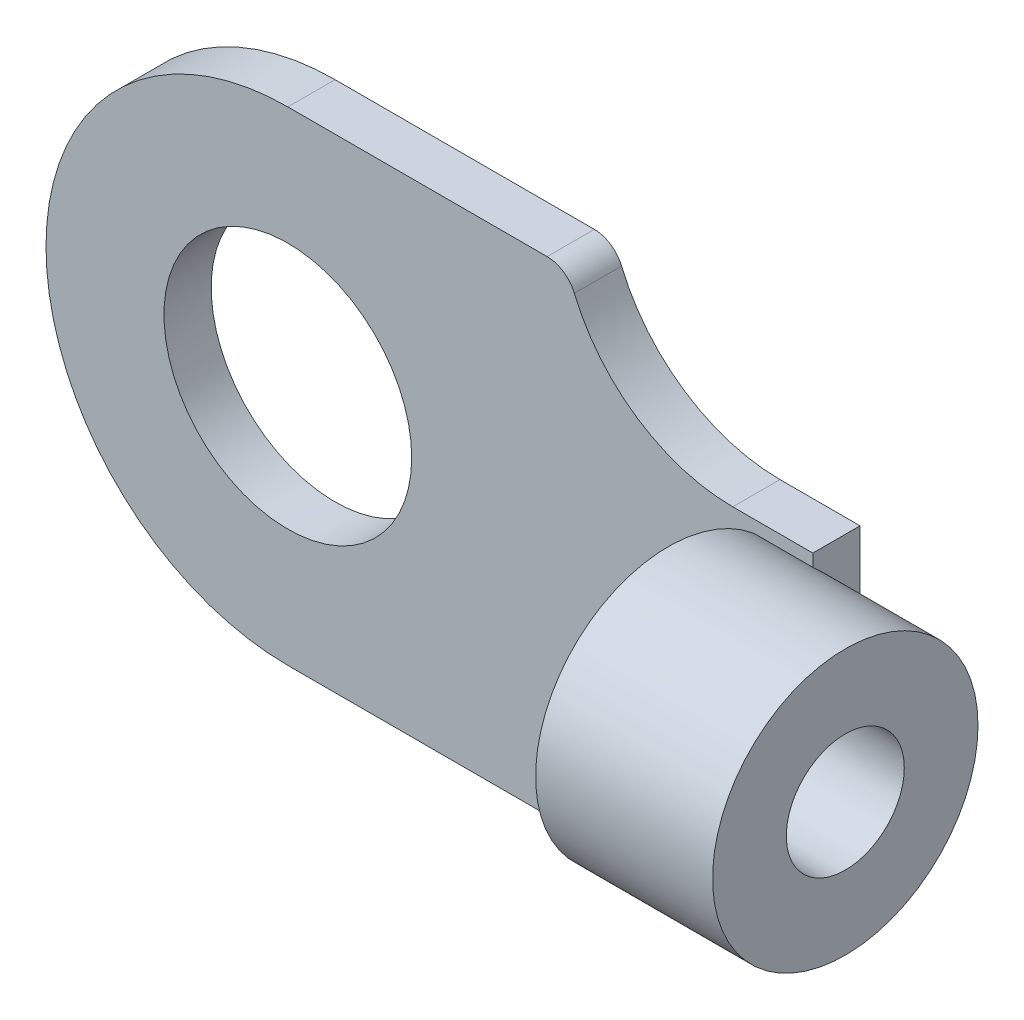
ISO-10303-21;
HEADER;
FILE_DESCRIPTION(('STEP AP214'),'2;1');
FILE_NAME('part.step','',(''),(''),'','','');
FILE_SCHEMA(('AUTOMOTIVE_DESIGN { 1 0 10303 214 1 1 1 1 }'));
ENDSEC;
DATA;
#1=APPLICATION_CONTEXT('core data for automotive mechanical design processes');
#2=APPLICATION_PROTOCOL_DEFINITION('international standard','automotive_design',2000,#1);
#3=PRODUCT_CONTEXT('',#1,'mechanical');
#4=PRODUCT('Part','Part','',(#3));
#5=PRODUCT_RELATED_PRODUCT_CATEGORY('part','',(#4));
#6=PRODUCT_DEFINITION_FORMATION('','',#4);
#7=PRODUCT_DEFINITION_CONTEXT('part definition',#1,'design');
#8=PRODUCT_DEFINITION('design','',#6,#7);
#9=PRODUCT_DEFINITION_SHAPE('','',#8);
#10=(LENGTH_UNIT() NAMED_UNIT(*) SI_UNIT(.MILLI.,.METRE.));
#11=(NAMED_UNIT(*) PLANE_ANGLE_UNIT() SI_UNIT($,.RADIAN.));
#12=(NAMED_UNIT(*) SI_UNIT($,.STERADIAN.) SOLID_ANGLE_UNIT());
#13=UNCERTAINTY_MEASURE_WITH_UNIT(LENGTH_MEASURE(1.E-05),#10,'distance_accuracy_value','');
#14=(GEOMETRIC_REPRESENTATION_CONTEXT(3) GLOBAL_UNCERTAINTY_ASSIGNED_CONTEXT((#13)) GLOBAL_UNIT_ASSIGNED_CONTEXT((#10,
#11,#12)) REPRESENTATION_CONTEXT('',''));
#15=CARTESIAN_POINT('',(0.,0.,0.));
#16=DIRECTION('',(0.,0.,1.));
#17=DIRECTION('',(1.,0.,0.));
#18=AXIS2_PLACEMENT_3D('',#15,#16,#17);
#19=CARTESIAN_POINT('',(10.25,0.180380871620109,0.8));
#20=DIRECTION('',(-1.,0.,0.));
#21=DIRECTION('',(0.,-1.,0.));
#22=AXIS2_PLACEMENT_3D('',#19,#20,#21);
#23=PLANE('',#22);
#24=CARTESIAN_POINT('',(10.25,0.,2.25));
#25=DIRECTION('',(1.,0.,0.));
#26=DIRECTION('',(0.,0.,-1.));
#27=AXIS2_PLACEMENT_3D('',#24,#25,#26);
#28=CIRCLE('',#27,1.);
#29=CARTESIAN_POINT('',(10.25,0.,1.25));
#30=VERTEX_POINT('',#29);
#31=EDGE_CURVE('E145',#30,#30,#28,.T.);
#32=ORIENTED_EDGE('',*,*,#31,.F.);
#33=EDGE_LOOP('',(#32));
#34=FACE_BOUND('',#33,.T.);
#35=CARTESIAN_POINT('',(10.25,0.,2.25));
#36=DIRECTION('',(1.,0.,0.));
#37=DIRECTION('',(0.,0.,-1.));
#38=AXIS2_PLACEMENT_3D('',#35,#36,#37);
#39=CIRCLE('',#38,2.25);
#40=CARTESIAN_POINT('',(10.25,0.,0.));
#41=VERTEX_POINT('',#40);
#42=EDGE_CURVE('E260',#41,#41,#39,.T.);
#43=ORIENTED_EDGE('',*,*,#42,.T.);
#44=EDGE_LOOP('',(#43));
#45=FACE_BOUND('',#44,.T.);
#46=ADVANCED_FACE('F31',(#34,#45),#23,.F.);
#47=CARTESIAN_POINT('',(6.8929732239143,4.83939185197431,0.8));
#48=DIRECTION('',(0.,0.,1.));
#49=DIRECTION('',(1.,0.,0.));
#50=AXIS2_PLACEMENT_3D('',#47,#48,#49);
#51=PLANE('',#50);
#52=DIRECTION('',(0.,-1.,0.));
#53=VECTOR('',#52,1.);
#54=CARTESIAN_POINT('',(8.25,4.83939185197431,0.8));
#55=LINE('',#54,#53);
#56=CARTESIAN_POINT('',(8.25,1.9303808716201,0.8));
#57=VERTEX_POINT('',#56);
#58=CARTESIAN_POINT('',(8.25,1.72046505340854,0.799999999999999));
#59=VERTEX_POINT('',#58);
#60=EDGE_CURVE('E148',#57,#59,#55,.T.);
#61=ORIENTED_EDGE('',*,*,#60,.F.);
#62=DIRECTION('',(-1.,0.,0.));
#63=VECTOR('',#62,1.);
#64=CARTESIAN_POINT('',(10.25,1.9303808716201,0.8));
#65=LINE('',#64,#63);
#66=CARTESIAN_POINT('',(6.8929732239143,1.9303808716201,0.8));
#67=VERTEX_POINT('',#66);
#68=EDGE_CURVE('E180',#57,#67,#65,.T.);
#69=ORIENTED_EDGE('',*,*,#68,.T.);
#70=CARTESIAN_POINT('',(6.8929732239143,4.83939185197431,0.8));
#71=DIRECTION('',(0.,0.,-1.));
#72=DIRECTION('',(1.,0.,0.));
#73=AXIS2_PLACEMENT_3D('',#70,#71,#72);
#74=CIRCLE('',#73,2.90901098035421);
#75=CARTESIAN_POINT('',(4.20696964598898,3.72237365015585,0.8));
#76=VERTEX_POINT('',#75);
#77=EDGE_CURVE('E167',#67,#76,#74,.T.);
#78=ORIENTED_EDGE('',*,*,#77,.T.);
#79=CARTESIAN_POINT('',(3.74530009642986,3.5303808716201,0.8));
#80=DIRECTION('',(0.,0.,1.));
#81=DIRECTION('',(1.,0.,0.));
#82=AXIS2_PLACEMENT_3D('',#79,#80,#81);
#83=CIRCLE('',#82,0.5);
#84=CARTESIAN_POINT('',(3.74530009642986,4.0303808716201,0.8));
#85=VERTEX_POINT('',#84);
#86=EDGE_CURVE('E54',#76,#85,#83,.T.);
#87=ORIENTED_EDGE('',*,*,#86,.T.);
#88=DIRECTION('',(-1.,0.,0.));
#89=VECTOR('',#88,1.);
#90=CARTESIAN_POINT('',(-0.65,4.0303808716201,0.8));
#91=LINE('',#90,#89);
#92=CARTESIAN_POINT('',(-0.65,4.0303808716201,0.8));
#93=VERTEX_POINT('',#92);
#94=EDGE_CURVE('E169',#85,#93,#91,.T.);
#95=ORIENTED_EDGE('',*,*,#94,.T.);
#96=CARTESIAN_POINT('',(-0.649999999999999,-0.0696191283799023,0.8));
#97=DIRECTION('',(0.,0.,1.));
#98=DIRECTION('',(1.,0.,0.));
#99=AXIS2_PLACEMENT_3D('',#96,#97,#98);
#100=CIRCLE('',#99,4.1);
#101=CARTESIAN_POINT('',(-0.649999999999998,-4.1696191283799,0.8));
#102=VERTEX_POINT('',#101);
#103=EDGE_CURVE('E172',#93,#102,#100,.T.);
#104=ORIENTED_EDGE('',*,*,#103,.T.);
#105=DIRECTION('',(1.,0.,0.));
#106=VECTOR('',#105,1.);
#107=CARTESIAN_POINT('',(-0.649999999999998,-4.1696191283799,0.8));
#108=LINE('',#107,#106);
#109=CARTESIAN_POINT('',(3.74530009642986,-4.1696191283799,0.8));
#110=VERTEX_POINT('',#109);
#111=EDGE_CURVE('E174',#102,#110,#108,.T.);
#112=ORIENTED_EDGE('',*,*,#111,.T.);
#113=CARTESIAN_POINT('',(3.74530009642986,-3.6696191283799,0.8));
#114=DIRECTION('',(0.,0.,1.));
#115=DIRECTION('',(1.,0.,0.));
#116=AXIS2_PLACEMENT_3D('',#113,#114,#115);
#117=CIRCLE('',#116,0.5);
#118=CARTESIAN_POINT('',(4.20696964598898,-3.86161190691566,0.8));
#119=VERTEX_POINT('',#118);
#120=EDGE_CURVE('E219',#110,#119,#117,.T.);
#121=ORIENTED_EDGE('',*,*,#120,.T.);
#122=CARTESIAN_POINT('',(6.8929732239143,-4.97863010873411,0.8));
#123=DIRECTION('',(0.,0.,-1.));
#124=DIRECTION('',(-1.,0.,0.));
#125=AXIS2_PLACEMENT_3D('',#122,#123,#124);
#126=CIRCLE('',#125,2.90901098035421);
#127=CARTESIAN_POINT('',(6.8929732239143,-2.0696191283799,0.8));
#128=VERTEX_POINT('',#127);
#129=EDGE_CURVE('E177',#119,#128,#126,.T.);
#130=ORIENTED_EDGE('',*,*,#129,.T.);
#131=DIRECTION('',(1.,0.,0.));
#132=VECTOR('',#131,1.);
#133=CARTESIAN_POINT('',(10.25,-2.0696191283799,0.8));
#134=LINE('',#133,#132);
#135=CARTESIAN_POINT('',(8.25,-2.0696191283799,0.8));
#136=VERTEX_POINT('',#135);
#137=EDGE_CURVE('E144',#128,#136,#134,.T.);
#138=ORIENTED_EDGE('',*,*,#137,.T.);
#139=CARTESIAN_POINT('',(8.25,-1.72046505340851,0.8));
#140=VERTEX_POINT('',#139);
#141=EDGE_CURVE('E126',#140,#136,#55,.T.);
#142=ORIENTED_EDGE('',*,*,#141,.F.);
#143=DIRECTION('',(1.,0.,0.));
#144=VECTOR('',#143,1.);
#145=CARTESIAN_POINT('',(7.25,-1.72046505340852,0.8));
#146=LINE('',#145,#144);
#147=CARTESIAN_POINT('',(7.25,-1.72046505340852,0.8));
#148=VERTEX_POINT('',#147);
#149=EDGE_CURVE('E141',#148,#140,#146,.T.);
#150=ORIENTED_EDGE('',*,*,#149,.F.);
#151=DIRECTION('',(0.,1.,0.));
#152=VECTOR('',#151,1.);
#153=CARTESIAN_POINT('',(7.25,4.83939185197431,0.8));
#154=LINE('',#153,#152);
#155=CARTESIAN_POINT('',(7.25,1.72046505340854,0.8));
#156=VERTEX_POINT('',#155);
#157=EDGE_CURVE('E153',#148,#156,#154,.T.);
#158=ORIENTED_EDGE('',*,*,#157,.T.);
#159=DIRECTION('',(1.,0.,0.));
#160=VECTOR('',#159,1.);
#161=CARTESIAN_POINT('',(7.25,1.72046505340854,0.8));
#162=LINE('',#161,#160);
#163=EDGE_CURVE('E154',#59,#156,#162,.F.);
#164=ORIENTED_EDGE('',*,*,#163,.F.);
#165=EDGE_LOOP('',(#61,#69,#78,#87,#95,#104,#112,#121,#130,#138,#142,#150,#158,#164));
#166=FACE_BOUND('',#165,.T.);
#167=CARTESIAN_POINT('',(-0.649999999999999,-0.0696191283799023,0.8));
#168=DIRECTION('',(0.,0.,1.));
#169=DIRECTION('',(1.,0.,0.));
#170=AXIS2_PLACEMENT_3D('',#167,#168,#169);
#171=CIRCLE('',#170,2.1);
#172=CARTESIAN_POINT('',(1.45,-0.0696191283799023,0.8));
#173=VERTEX_POINT('',#172);
#174=EDGE_CURVE('E161',#173,#173,#171,.T.);
#175=ORIENTED_EDGE('',*,*,#174,.F.);
#176=EDGE_LOOP('',(#175));
#177=FACE_BOUND('',#176,.T.);
#178=ADVANCED_FACE('F138',(#166,#177),#51,.T.);
#179=CARTESIAN_POINT('',(6.8929732239143,4.83939185197431,0.));
#180=DIRECTION('',(0.,0.,1.));
#181=DIRECTION('',(1.,0.,0.));
#182=AXIS2_PLACEMENT_3D('',#179,#180,#181);
#183=PLANE('',#182);
#184=DIRECTION('',(-1.,0.,0.));
#185=VECTOR('',#184,1.);
#186=CARTESIAN_POINT('',(10.25,1.9303808716201,0.));
#187=LINE('',#186,#185);
#188=CARTESIAN_POINT('',(8.25,1.9303808716201,0.));
#189=VERTEX_POINT('',#188);
#190=CARTESIAN_POINT('',(6.8929732239143,1.9303808716201,0.));
#191=VERTEX_POINT('',#190);
#192=EDGE_CURVE('E170',#189,#191,#187,.T.);
#193=ORIENTED_EDGE('',*,*,#192,.F.);
#194=DIRECTION('',(0.,-1.,0.));
#195=VECTOR('',#194,1.);
#196=CARTESIAN_POINT('',(8.25,4.83939185197431,0.));
#197=LINE('',#196,#195);
#198=CARTESIAN_POINT('',(8.25,0.,0.));
#199=VERTEX_POINT('',#198);
#200=EDGE_CURVE('E46',#189,#199,#197,.T.);
#201=ORIENTED_EDGE('',*,*,#200,.T.);
#202=CARTESIAN_POINT('',(8.25,-2.0696191283799,0.));
#203=VERTEX_POINT('',#202);
#204=EDGE_CURVE('E129',#199,#203,#197,.T.);
#205=ORIENTED_EDGE('',*,*,#204,.T.);
#206=DIRECTION('',(1.,0.,0.));
#207=VECTOR('',#206,1.);
#208=CARTESIAN_POINT('',(10.25,-2.0696191283799,0.));
#209=LINE('',#208,#207);
#210=CARTESIAN_POINT('',(6.8929732239143,-2.0696191283799,0.));
#211=VERTEX_POINT('',#210);
#212=EDGE_CURVE('E194',#211,#203,#209,.T.);
#213=ORIENTED_EDGE('',*,*,#212,.F.);
#214=CARTESIAN_POINT('',(6.8929732239143,-4.97863010873411,0.));
#215=DIRECTION('',(0.,0.,-1.));
#216=DIRECTION('',(-1.,0.,0.));
#217=AXIS2_PLACEMENT_3D('',#214,#215,#216);
#218=CIRCLE('',#217,2.90901098035421);
#219=CARTESIAN_POINT('',(4.20696964598898,-3.86161190691566,0.));
#220=VERTEX_POINT('',#219);
#221=EDGE_CURVE('E192',#220,#211,#218,.T.);
#222=ORIENTED_EDGE('',*,*,#221,.F.);
#223=CARTESIAN_POINT('',(3.74530009642986,-3.6696191283799,0.));
#224=DIRECTION('',(0.,0.,1.));
#225=DIRECTION('',(1.,0.,0.));
#226=AXIS2_PLACEMENT_3D('',#223,#224,#225);
#227=CIRCLE('',#226,0.5);
#228=CARTESIAN_POINT('',(3.74530009642986,-4.1696191283799,0.));
#229=VERTEX_POINT('',#228);
#230=EDGE_CURVE('E214',#220,#229,#227,.F.);
#231=ORIENTED_EDGE('',*,*,#230,.T.);
#232=DIRECTION('',(1.,0.,0.));
#233=VECTOR('',#232,1.);
#234=CARTESIAN_POINT('',(-0.649999999999998,-4.1696191283799,0.));
#235=LINE('',#234,#233);
#236=CARTESIAN_POINT('',(-0.649999999999998,-4.1696191283799,0.));
#237=VERTEX_POINT('',#236);
#238=EDGE_CURVE('E189',#237,#229,#235,.T.);
#239=ORIENTED_EDGE('',*,*,#238,.F.);
#240=CARTESIAN_POINT('',(-0.649999999999999,-0.0696191283799023,0.));
#241=DIRECTION('',(0.,0.,1.));
#242=DIRECTION('',(1.,0.,0.));
#243=AXIS2_PLACEMENT_3D('',#240,#241,#242);
#244=CIRCLE('',#243,4.1);
#245=CARTESIAN_POINT('',(-0.65,4.0303808716201,0.));
#246=VERTEX_POINT('',#245);
#247=EDGE_CURVE('E187',#246,#237,#244,.T.);
#248=ORIENTED_EDGE('',*,*,#247,.F.);
#249=DIRECTION('',(-1.,0.,0.));
#250=VECTOR('',#249,1.);
#251=CARTESIAN_POINT('',(-0.65,4.0303808716201,0.));
#252=LINE('',#251,#250);
#253=CARTESIAN_POINT('',(3.74530009642986,4.0303808716201,0.));
#254=VERTEX_POINT('',#253);
#255=EDGE_CURVE('E185',#254,#246,#252,.T.);
#256=ORIENTED_EDGE('',*,*,#255,.F.);
#257=CARTESIAN_POINT('',(3.74530009642986,3.5303808716201,0.));
#258=DIRECTION('',(0.,0.,1.));
#259=DIRECTION('',(1.,0.,0.));
#260=AXIS2_PLACEMENT_3D('',#257,#258,#259);
#261=CIRCLE('',#260,0.5);
#262=CARTESIAN_POINT('',(4.20696964598898,3.72237365015585,0.));
#263=VERTEX_POINT('',#262);
#264=EDGE_CURVE('E212',#254,#263,#261,.F.);
#265=ORIENTED_EDGE('',*,*,#264,.T.);
#266=CARTESIAN_POINT('',(6.8929732239143,4.83939185197431,0.));
#267=DIRECTION('',(0.,0.,-1.));
#268=DIRECTION('',(1.,0.,0.));
#269=AXIS2_PLACEMENT_3D('',#266,#267,#268);
#270=CIRCLE('',#269,2.90901098035421);
#271=EDGE_CURVE('E164',#191,#263,#270,.T.);
#272=ORIENTED_EDGE('',*,*,#271,.F.);
#273=EDGE_LOOP('',(#193,#201,#205,#213,#222,#231,#239,#248,#256,#265,#272));
#274=FACE_BOUND('',#273,.T.);
#275=CARTESIAN_POINT('',(-0.649999999999999,-0.0696191283799023,0.));
#276=DIRECTION('',(0.,0.,1.));
#277=DIRECTION('',(1.,0.,0.));
#278=AXIS2_PLACEMENT_3D('',#275,#276,#277);
#279=CIRCLE('',#278,2.1);
#280=CARTESIAN_POINT('',(1.45,-0.0696191283799023,0.));
#281=VERTEX_POINT('',#280);
#282=EDGE_CURVE('E156',#281,#281,#279,.T.);
#283=ORIENTED_EDGE('',*,*,#282,.T.);
#284=EDGE_LOOP('',(#283));
#285=FACE_BOUND('',#284,.T.);
#286=ADVANCED_FACE('F230',(#274,#285),#183,.F.);
#287=CARTESIAN_POINT('',(6.8929732239143,4.83939185197431,0.8));
#288=DIRECTION('',(0.,0.,-1.));
#289=DIRECTION('',(-1.,0.,0.));
#290=AXIS2_PLACEMENT_3D('',#287,#288,#289);
#291=CYLINDRICAL_SURFACE('',#290,2.90901098035421);
#292=ORIENTED_EDGE('',*,*,#271,.T.);
#293=DIRECTION('',(0.,0.,-1.));
#294=VECTOR('',#293,1.);
#295=CARTESIAN_POINT('',(4.20696964598898,3.72237365015585,0.8));
#296=LINE('',#295,#294);
#297=EDGE_CURVE('E11',#263,#76,#296,.F.);
#298=ORIENTED_EDGE('',*,*,#297,.T.);
#299=ORIENTED_EDGE('',*,*,#77,.F.);
#300=DIRECTION('',(0.,0.,-1.));
#301=VECTOR('',#300,1.);
#302=CARTESIAN_POINT('',(6.8929732239143,1.9303808716201,0.8));
#303=LINE('',#302,#301);
#304=EDGE_CURVE('E182',#67,#191,#303,.T.);
#305=ORIENTED_EDGE('',*,*,#304,.T.);
#306=EDGE_LOOP('',(#292,#298,#299,#305));
#307=FACE_BOUND('',#306,.T.);
#308=ADVANCED_FACE('F302',(#307),#291,.F.);
#309=CARTESIAN_POINT('',(-0.65,4.0303808716201,0.8));
#310=DIRECTION('',(0.,-1.,0.));
#311=DIRECTION('',(0.,0.,-1.));
#312=AXIS2_PLACEMENT_3D('',#309,#310,#311);
#313=PLANE('',#312);
#314=ORIENTED_EDGE('',*,*,#94,.F.);
#315=DIRECTION('',(0.,0.,-1.));
#316=VECTOR('',#315,1.);
#317=CARTESIAN_POINT('',(3.74530009642986,4.0303808716201,0.8));
#318=LINE('',#317,#316);
#319=EDGE_CURVE('E39',#85,#254,#318,.T.);
#320=ORIENTED_EDGE('',*,*,#319,.T.);
#321=ORIENTED_EDGE('',*,*,#255,.T.);
#322=DIRECTION('',(0.,0.,-1.));
#323=VECTOR('',#322,1.);
#324=CARTESIAN_POINT('',(-0.65,4.0303808716201,0.8));
#325=LINE('',#324,#323);
#326=EDGE_CURVE('E206',#93,#246,#325,.T.);
#327=ORIENTED_EDGE('',*,*,#326,.F.);
#328=EDGE_LOOP('',(#314,#320,#321,#327));
#329=FACE_BOUND('',#328,.T.);
#330=ADVANCED_FACE('F224',(#329),#313,.F.);
#331=CARTESIAN_POINT('',(-0.649999999999999,-0.0696191283799023,0.8));
#332=DIRECTION('',(0.,0.,-1.));
#333=DIRECTION('',(-1.,0.,0.));
#334=AXIS2_PLACEMENT_3D('',#331,#332,#333);
#335=CYLINDRICAL_SURFACE('',#334,4.1);
#336=ORIENTED_EDGE('',*,*,#247,.T.);
#337=DIRECTION('',(0.,0.,-1.));
#338=VECTOR('',#337,1.);
#339=CARTESIAN_POINT('',(-0.649999999999998,-4.1696191283799,0.8));
#340=LINE('',#339,#338);
#341=EDGE_CURVE('E203',#102,#237,#340,.T.);
#342=ORIENTED_EDGE('',*,*,#341,.F.);
#343=ORIENTED_EDGE('',*,*,#103,.F.);
#344=ORIENTED_EDGE('',*,*,#326,.T.);
#345=EDGE_LOOP('',(#336,#342,#343,#344));
#346=FACE_BOUND('',#345,.T.);
#347=ADVANCED_FACE('F236',(#346),#335,.T.);
#348=CARTESIAN_POINT('',(-0.649999999999998,-4.1696191283799,0.8));
#349=DIRECTION('',(0.,1.,0.));
#350=DIRECTION('',(0.,0.,1.));
#351=AXIS2_PLACEMENT_3D('',#348,#349,#350);
#352=PLANE('',#351);
#353=ORIENTED_EDGE('',*,*,#238,.T.);
#354=DIRECTION('',(0.,0.,-1.));
#355=VECTOR('',#354,1.);
#356=CARTESIAN_POINT('',(3.74530009642986,-4.1696191283799,0.8));
#357=LINE('',#356,#355);
#358=EDGE_CURVE('E216',#229,#110,#357,.F.);
#359=ORIENTED_EDGE('',*,*,#358,.T.);
#360=ORIENTED_EDGE('',*,*,#111,.F.);
#361=ORIENTED_EDGE('',*,*,#341,.T.);
#362=EDGE_LOOP('',(#353,#359,#360,#361));
#363=FACE_BOUND('',#362,.T.);
#364=ADVANCED_FACE('F240',(#363),#352,.F.);
#365=CARTESIAN_POINT('',(6.8929732239143,-4.97863010873411,0.8));
#366=DIRECTION('',(0.,0.,-1.));
#367=DIRECTION('',(-1.,0.,0.));
#368=AXIS2_PLACEMENT_3D('',#365,#366,#367);
#369=CYLINDRICAL_SURFACE('',#368,2.90901098035421);
#370=ORIENTED_EDGE('',*,*,#129,.F.);
#371=DIRECTION('',(0.,0.,-1.));
#372=VECTOR('',#371,1.);
#373=CARTESIAN_POINT('',(4.20696964598898,-3.86161190691566,0.8));
#374=LINE('',#373,#372);
#375=EDGE_CURVE('E209',#119,#220,#374,.T.);
#376=ORIENTED_EDGE('',*,*,#375,.T.);
#377=ORIENTED_EDGE('',*,*,#221,.T.);
#378=DIRECTION('',(0.,0.,-1.));
#379=VECTOR('',#378,1.);
#380=CARTESIAN_POINT('',(6.8929732239143,-2.0696191283799,0.8));
#381=LINE('',#380,#379);
#382=EDGE_CURVE('E200',#128,#211,#381,.T.);
#383=ORIENTED_EDGE('',*,*,#382,.F.);
#384=EDGE_LOOP('',(#370,#376,#377,#383));
#385=FACE_BOUND('',#384,.T.);
#386=ADVANCED_FACE('F249',(#385),#369,.F.);
#387=CARTESIAN_POINT('',(10.25,-2.0696191283799,0.8));
#388=DIRECTION('',(0.,1.,0.));
#389=DIRECTION('',(-1.,0.,0.));
#390=AXIS2_PLACEMENT_3D('',#387,#388,#389);
#391=PLANE('',#390);
#392=ORIENTED_EDGE('',*,*,#212,.T.);
#393=DIRECTION('',(0.,0.,1.));
#394=VECTOR('',#393,1.);
#395=CARTESIAN_POINT('',(8.25,-2.0696191283799,0.8));
#396=LINE('',#395,#394);
#397=EDGE_CURVE('E146',#203,#136,#396,.T.);
#398=ORIENTED_EDGE('',*,*,#397,.T.);
#399=ORIENTED_EDGE('',*,*,#137,.F.);
#400=ORIENTED_EDGE('',*,*,#382,.T.);
#401=EDGE_LOOP('',(#392,#398,#399,#400));
#402=FACE_BOUND('',#401,.T.);
#403=ADVANCED_FACE('F253',(#402),#391,.F.);
#404=CARTESIAN_POINT('',(10.25,1.9303808716201,0.8));
#405=DIRECTION('',(0.,-1.,0.));
#406=DIRECTION('',(1.,0.,0.));
#407=AXIS2_PLACEMENT_3D('',#404,#405,#406);
#408=PLANE('',#407);
#409=ORIENTED_EDGE('',*,*,#68,.F.);
#410=DIRECTION('',(0.,0.,-1.));
#411=VECTOR('',#410,1.);
#412=CARTESIAN_POINT('',(8.25,1.9303808716201,0.8));
#413=LINE('',#412,#411);
#414=EDGE_CURVE('E133',#57,#189,#413,.T.);
#415=ORIENTED_EDGE('',*,*,#414,.T.);
#416=ORIENTED_EDGE('',*,*,#192,.T.);
#417=ORIENTED_EDGE('',*,*,#304,.F.);
#418=EDGE_LOOP('',(#409,#415,#416,#417));
#419=FACE_BOUND('',#418,.T.);
#420=ADVANCED_FACE('F278',(#419),#408,.F.);
#421=CARTESIAN_POINT('',(-0.649999999999999,-0.0696191283799023,0.8));
#422=DIRECTION('',(0.,0.,-1.));
#423=DIRECTION('',(-1.,0.,0.));
#424=AXIS2_PLACEMENT_3D('',#421,#422,#423);
#425=CYLINDRICAL_SURFACE('',#424,2.1);
#426=ORIENTED_EDGE('',*,*,#174,.T.);
#427=EDGE_LOOP('',(#426));
#428=FACE_BOUND('',#427,.T.);
#429=ORIENTED_EDGE('',*,*,#282,.F.);
#430=EDGE_LOOP('',(#429));
#431=FACE_BOUND('',#430,.T.);
#432=ADVANCED_FACE('F269',(#428,#431),#425,.F.);
#433=CARTESIAN_POINT('',(7.25,0.,2.25));
#434=DIRECTION('',(1.,0.,0.));
#435=DIRECTION('',(0.,0.,-1.));
#436=AXIS2_PLACEMENT_3D('',#433,#434,#435);
#437=CYLINDRICAL_SURFACE('',#436,2.25);
#438=ORIENTED_EDGE('',*,*,#42,.F.);
#439=EDGE_LOOP('',(#438));
#440=FACE_BOUND('',#439,.T.);
#441=ORIENTED_EDGE('',*,*,#149,.T.);
#442=CARTESIAN_POINT('',(8.25,0.,2.25));
#443=DIRECTION('',(1.,0.,0.));
#444=DIRECTION('',(0.,1.,0.));
#445=AXIS2_PLACEMENT_3D('',#442,#443,#444);
#446=CIRCLE('',#445,2.25);
#447=EDGE_CURVE('E123',#140,#199,#446,.T.);
#448=ORIENTED_EDGE('',*,*,#447,.T.);
#449=EDGE_CURVE('E134',#199,#59,#446,.T.);
#450=ORIENTED_EDGE('',*,*,#449,.T.);
#451=ORIENTED_EDGE('',*,*,#163,.T.);
#452=CARTESIAN_POINT('',(7.25,0.,2.25));
#453=DIRECTION('',(1.,0.,0.));
#454=DIRECTION('',(0.,0.,-1.));
#455=AXIS2_PLACEMENT_3D('',#452,#453,#454);
#456=CIRCLE('',#455,2.25);
#457=EDGE_CURVE('E152',#156,#148,#456,.T.);
#458=ORIENTED_EDGE('',*,*,#457,.T.);
#459=EDGE_LOOP('',(#441,#448,#450,#451,#458));
#460=FACE_BOUND('',#459,.T.);
#461=ADVANCED_FACE('F150',(#440,#460),#437,.T.);
#462=CARTESIAN_POINT('',(7.25,0.,2.25));
#463=DIRECTION('',(1.,0.,0.));
#464=DIRECTION('',(0.,0.,-1.));
#465=AXIS2_PLACEMENT_3D('',#462,#463,#464);
#466=PLANE('',#465);
#467=ORIENTED_EDGE('',*,*,#157,.F.);
#468=ORIENTED_EDGE('',*,*,#457,.F.);
#469=EDGE_LOOP('',(#467,#468));
#470=FACE_BOUND('',#469,.T.);
#471=CARTESIAN_POINT('',(7.25,0.,2.25));
#472=DIRECTION('',(1.,0.,0.));
#473=DIRECTION('',(0.,0.,-1.));
#474=AXIS2_PLACEMENT_3D('',#471,#472,#473);
#475=CIRCLE('',#474,1.);
#476=CARTESIAN_POINT('',(7.25,0.,1.25));
#477=VERTEX_POINT('',#476);
#478=EDGE_CURVE('E257',#477,#477,#475,.T.);
#479=ORIENTED_EDGE('',*,*,#478,.T.);
#480=EDGE_LOOP('',(#479));
#481=FACE_BOUND('',#480,.T.);
#482=ADVANCED_FACE('F268',(#470,#481),#466,.F.);
#483=CARTESIAN_POINT('',(7.25,0.,2.25));
#484=DIRECTION('',(1.,0.,0.));
#485=DIRECTION('',(0.,0.,-1.));
#486=AXIS2_PLACEMENT_3D('',#483,#484,#485);
#487=CYLINDRICAL_SURFACE('',#486,1.);
#488=ORIENTED_EDGE('',*,*,#478,.F.);
#489=EDGE_LOOP('',(#488));
#490=FACE_BOUND('',#489,.T.);
#491=ORIENTED_EDGE('',*,*,#31,.T.);
#492=EDGE_LOOP('',(#491));
#493=FACE_BOUND('',#492,.T.);
#494=ADVANCED_FACE('F275',(#490,#493),#487,.F.);
#495=CARTESIAN_POINT('',(3.74530009642986,-3.6696191283799,0.8));
#496=DIRECTION('',(0.,0.,-1.));
#497=DIRECTION('',(-1.,0.,0.));
#498=AXIS2_PLACEMENT_3D('',#495,#496,#497);
#499=CYLINDRICAL_SURFACE('',#498,0.5);
#500=ORIENTED_EDGE('',*,*,#120,.F.);
#501=ORIENTED_EDGE('',*,*,#358,.F.);
#502=ORIENTED_EDGE('',*,*,#230,.F.);
#503=ORIENTED_EDGE('',*,*,#375,.F.);
#504=EDGE_LOOP('',(#500,#501,#502,#503));
#505=FACE_BOUND('',#504,.T.);
#506=ADVANCED_FACE('F246',(#505),#499,.T.);
#507=CARTESIAN_POINT('',(3.74530009642986,3.5303808716201,0.8));
#508=DIRECTION('',(0.,0.,-1.));
#509=DIRECTION('',(-1.,0.,0.));
#510=AXIS2_PLACEMENT_3D('',#507,#508,#509);
#511=CYLINDRICAL_SURFACE('',#510,0.5);
#512=ORIENTED_EDGE('',*,*,#86,.F.);
#513=ORIENTED_EDGE('',*,*,#297,.F.);
#514=ORIENTED_EDGE('',*,*,#264,.F.);
#515=ORIENTED_EDGE('',*,*,#319,.F.);
#516=EDGE_LOOP('',(#512,#513,#514,#515));
#517=FACE_BOUND('',#516,.T.);
#518=ADVANCED_FACE('F33',(#517),#511,.T.);
#519=CARTESIAN_POINT('',(8.25,2.44090314705182,5.5361694522027));
#520=DIRECTION('',(-1.,0.,0.));
#521=DIRECTION('',(0.,-1.,0.));
#522=AXIS2_PLACEMENT_3D('',#519,#520,#521);
#523=PLANE('',#522);
#524=ORIENTED_EDGE('',*,*,#141,.T.);
#525=ORIENTED_EDGE('',*,*,#397,.F.);
#526=ORIENTED_EDGE('',*,*,#204,.F.);
#527=ORIENTED_EDGE('',*,*,#447,.F.);
#528=EDGE_LOOP('',(#524,#525,#526,#527));
#529=FACE_BOUND('',#528,.T.);
#530=ADVANCED_FACE('F125',(#529),#523,.F.);
#531=ORIENTED_EDGE('',*,*,#60,.T.);
#532=ORIENTED_EDGE('',*,*,#449,.F.);
#533=ORIENTED_EDGE('',*,*,#200,.F.);
#534=ORIENTED_EDGE('',*,*,#414,.F.);
#535=EDGE_LOOP('',(#531,#532,#533,#534));
#536=FACE_BOUND('',#535,.T.);
#537=ADVANCED_FACE('F317',(#536),#523,.F.);
#538=CLOSED_SHELL('',(#46,#178,#286,#308,#330,#347,#364,#386,#403,#420,#432,#461,#482,#494,#506,
#518,#530,#537));
#539=MANIFOLD_SOLID_BREP('B2',#538);
#540=ADVANCED_BREP_SHAPE_REPRESENTATION('',(#18,#539),#14);
#541=SHAPE_DEFINITION_REPRESENTATION(#9,#540);
ENDSEC;
END-ISO-10303-21;
